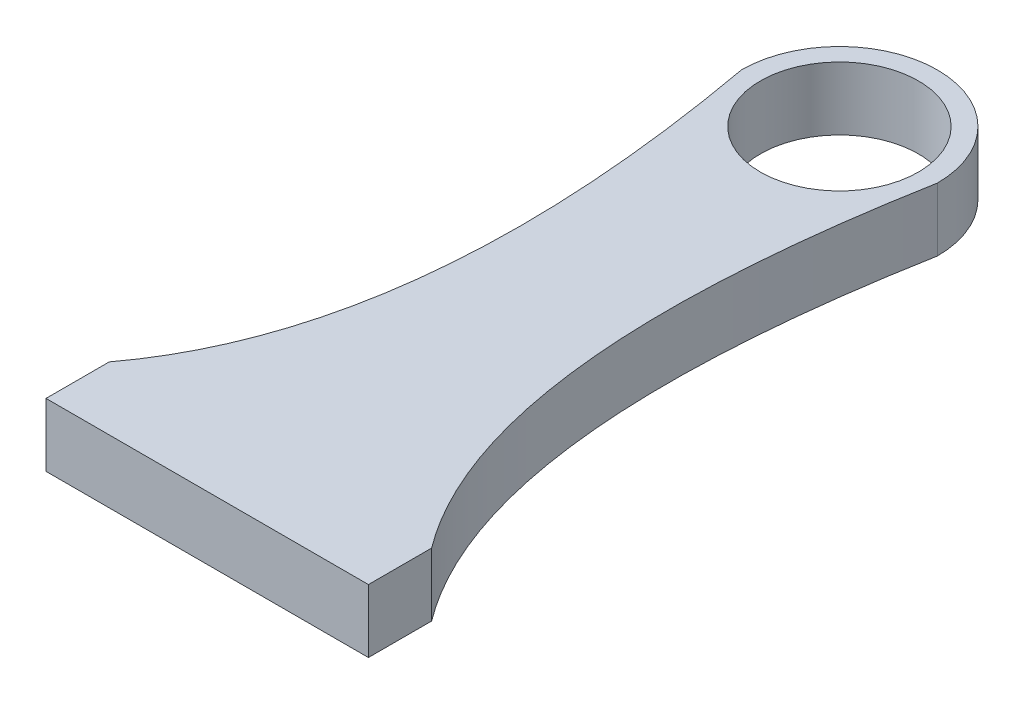
ISO-10303-21;
HEADER;
FILE_DESCRIPTION(('STEP AP214'),'2;1');
FILE_NAME('part.step','',(''),(''),'','','');
FILE_SCHEMA(('AUTOMOTIVE_DESIGN { 1 0 10303 214 1 1 1 1 }'));
ENDSEC;
DATA;
#1=APPLICATION_CONTEXT('core data for automotive mechanical design processes');
#2=APPLICATION_PROTOCOL_DEFINITION('international standard','automotive_design',2000,#1);
#3=PRODUCT_CONTEXT('',#1,'mechanical');
#4=PRODUCT('Part','Part','',(#3));
#5=PRODUCT_RELATED_PRODUCT_CATEGORY('part','',(#4));
#6=PRODUCT_DEFINITION_FORMATION('','',#4);
#7=PRODUCT_DEFINITION_CONTEXT('part definition',#1,'design');
#8=PRODUCT_DEFINITION('design','',#6,#7);
#9=PRODUCT_DEFINITION_SHAPE('','',#8);
#10=(LENGTH_UNIT() NAMED_UNIT(*) SI_UNIT(.MILLI.,.METRE.));
#11=(NAMED_UNIT(*) PLANE_ANGLE_UNIT() SI_UNIT($,.RADIAN.));
#12=(NAMED_UNIT(*) SI_UNIT($,.STERADIAN.) SOLID_ANGLE_UNIT());
#13=UNCERTAINTY_MEASURE_WITH_UNIT(LENGTH_MEASURE(1.E-05),#10,'distance_accuracy_value','');
#14=(GEOMETRIC_REPRESENTATION_CONTEXT(3) GLOBAL_UNCERTAINTY_ASSIGNED_CONTEXT((#13)) GLOBAL_UNIT_ASSIGNED_CONTEXT((#10,
#11,#12)) REPRESENTATION_CONTEXT('',''));
#15=CARTESIAN_POINT('',(0.,0.,0.));
#16=DIRECTION('',(0.,0.,1.));
#17=DIRECTION('',(1.,0.,0.));
#18=AXIS2_PLACEMENT_3D('',#15,#16,#17);
#19=CARTESIAN_POINT('',(0.,10.,0.));
#20=DIRECTION('',(0.,1.,0.));
#21=DIRECTION('',(0.,0.,1.));
#22=AXIS2_PLACEMENT_3D('',#19,#20,#21);
#23=PLANE('',#22);
#24=CARTESIAN_POINT('',(15.5,10.,0.));
#25=CARTESIAN_POINT('',(4.23681046825259,10.,61.6464472015278));
#26=CARTESIAN_POINT('',(25.5,10.,90.));
#27=B_SPLINE_CURVE_WITH_KNOTS('',2,(#24,#25,#26),.UNSPECIFIED.,.F.,.F.,(3,3),(0.,1.),.UNSPECIFIED.);
#28=CARTESIAN_POINT('',(15.5,10.,0.));
#29=VERTEX_POINT('',#28);
#30=CARTESIAN_POINT('',(25.5,10.,90.));
#31=VERTEX_POINT('',#30);
#32=EDGE_CURVE('E147',#29,#31,#27,.T.);
#33=ORIENTED_EDGE('',*,*,#32,.F.);
#34=CARTESIAN_POINT('',(0.,10.,0.));
#35=DIRECTION('',(0.,1.,0.));
#36=DIRECTION('',(0.,0.,1.));
#37=AXIS2_PLACEMENT_3D('',#34,#35,#36);
#38=CIRCLE('',#37,15.5);
#39=CARTESIAN_POINT('',(-15.5,10.,0.));
#40=VERTEX_POINT('',#39);
#41=EDGE_CURVE('E79',#29,#40,#38,.T.);
#42=ORIENTED_EDGE('',*,*,#41,.T.);
#43=CARTESIAN_POINT('',(-25.5,10.,90.));
#44=CARTESIAN_POINT('',(-4.23681046825257,10.,61.6464472015278));
#45=CARTESIAN_POINT('',(-15.5,10.,0.));
#46=B_SPLINE_CURVE_WITH_KNOTS('',2,(#43,#44,#45),.UNSPECIFIED.,.F.,.F.,(3,3),(0.,1.),.UNSPECIFIED.);
#47=CARTESIAN_POINT('',(-25.5,10.,90.));
#48=VERTEX_POINT('',#47);
#49=EDGE_CURVE('E49',#48,#40,#46,.T.);
#50=ORIENTED_EDGE('',*,*,#49,.F.);
#51=DIRECTION('',(0.,0.,1.));
#52=VECTOR('',#51,1.);
#53=CARTESIAN_POINT('',(-25.5,10.,90.));
#54=LINE('',#53,#52);
#55=CARTESIAN_POINT('',(-25.5,10.,100.));
#56=VERTEX_POINT('',#55);
#57=EDGE_CURVE('E77',#48,#56,#54,.T.);
#58=ORIENTED_EDGE('',*,*,#57,.T.);
#59=DIRECTION('',(1.,0.,0.));
#60=VECTOR('',#59,1.);
#61=CARTESIAN_POINT('',(-15.5,10.,100.));
#62=LINE('',#61,#60);
#63=CARTESIAN_POINT('',(25.5,10.,100.));
#64=VERTEX_POINT('',#63);
#65=EDGE_CURVE('E71',#56,#64,#62,.T.);
#66=ORIENTED_EDGE('',*,*,#65,.T.);
#67=DIRECTION('',(0.,0.,-1.));
#68=VECTOR('',#67,1.);
#69=CARTESIAN_POINT('',(25.5,10.,90.));
#70=LINE('',#69,#68);
#71=EDGE_CURVE('E75',#64,#31,#70,.T.);
#72=ORIENTED_EDGE('',*,*,#71,.T.);
#73=EDGE_LOOP('',(#33,#42,#50,#58,#66,#72));
#74=FACE_BOUND('',#73,.T.);
#75=CARTESIAN_POINT('',(0.,10.,0.));
#76=DIRECTION('',(0.,1.,0.));
#77=DIRECTION('',(0.,0.,1.));
#78=AXIS2_PLACEMENT_3D('',#75,#76,#77);
#79=CIRCLE('',#78,12.5);
#80=CARTESIAN_POINT('',(0.,10.,12.5));
#81=VERTEX_POINT('',#80);
#82=EDGE_CURVE('E107',#81,#81,#79,.T.);
#83=ORIENTED_EDGE('',*,*,#82,.F.);
#84=EDGE_LOOP('',(#83));
#85=FACE_BOUND('',#84,.T.);
#86=ADVANCED_FACE('F35',(#74,#85),#23,.T.);
#87=CARTESIAN_POINT('',(0.,0.,0.));
#88=DIRECTION('',(0.,1.,0.));
#89=DIRECTION('',(0.,0.,1.));
#90=AXIS2_PLACEMENT_3D('',#87,#88,#89);
#91=PLANE('',#90);
#92=CARTESIAN_POINT('',(0.,0.,0.));
#93=DIRECTION('',(0.,1.,0.));
#94=DIRECTION('',(0.,0.,1.));
#95=AXIS2_PLACEMENT_3D('',#92,#93,#94);
#96=CIRCLE('',#95,15.5);
#97=CARTESIAN_POINT('',(15.5,0.,0.));
#98=VERTEX_POINT('',#97);
#99=CARTESIAN_POINT('',(-15.5,0.,0.));
#100=VERTEX_POINT('',#99);
#101=EDGE_CURVE('E110',#98,#100,#96,.T.);
#102=ORIENTED_EDGE('',*,*,#101,.F.);
#103=CARTESIAN_POINT('',(15.5,0.,0.));
#104=CARTESIAN_POINT('',(4.23681046825259,0.,61.6464472015278));
#105=CARTESIAN_POINT('',(25.5,0.,90.));
#106=B_SPLINE_CURVE_WITH_KNOTS('',2,(#103,#104,#105),.UNSPECIFIED.,.F.,.F.,(3,3),(0.,1.),.UNSPECIFIED.);
#107=CARTESIAN_POINT('',(25.5,0.,90.));
#108=VERTEX_POINT('',#107);
#109=EDGE_CURVE('E135',#98,#108,#106,.T.);
#110=ORIENTED_EDGE('',*,*,#109,.T.);
#111=DIRECTION('',(0.,0.,-1.));
#112=VECTOR('',#111,1.);
#113=CARTESIAN_POINT('',(25.5,0.,90.));
#114=LINE('',#113,#112);
#115=CARTESIAN_POINT('',(25.5,0.,100.));
#116=VERTEX_POINT('',#115);
#117=EDGE_CURVE('E95',#116,#108,#114,.T.);
#118=ORIENTED_EDGE('',*,*,#117,.F.);
#119=DIRECTION('',(1.,0.,0.));
#120=VECTOR('',#119,1.);
#121=CARTESIAN_POINT('',(-15.5,0.,100.));
#122=LINE('',#121,#120);
#123=CARTESIAN_POINT('',(-25.5,0.,100.));
#124=VERTEX_POINT('',#123);
#125=EDGE_CURVE('E58',#124,#116,#122,.T.);
#126=ORIENTED_EDGE('',*,*,#125,.F.);
#127=DIRECTION('',(0.,0.,1.));
#128=VECTOR('',#127,1.);
#129=CARTESIAN_POINT('',(-25.5,0.,90.));
#130=LINE('',#129,#128);
#131=CARTESIAN_POINT('',(-25.5,0.,90.));
#132=VERTEX_POINT('',#131);
#133=EDGE_CURVE('E100',#132,#124,#130,.T.);
#134=ORIENTED_EDGE('',*,*,#133,.F.);
#135=CARTESIAN_POINT('',(-25.5,0.,90.));
#136=CARTESIAN_POINT('',(-4.23681046825257,0.,61.6464472015278));
#137=CARTESIAN_POINT('',(-15.5,0.,0.));
#138=B_SPLINE_CURVE_WITH_KNOTS('',2,(#135,#136,#137),.UNSPECIFIED.,.F.,.F.,(3,3),(0.,1.),.UNSPECIFIED.);
#139=EDGE_CURVE('E93',#132,#100,#138,.T.);
#140=ORIENTED_EDGE('',*,*,#139,.T.);
#141=EDGE_LOOP('',(#102,#110,#118,#126,#134,#140));
#142=FACE_BOUND('',#141,.T.);
#143=CARTESIAN_POINT('',(0.,0.,0.));
#144=DIRECTION('',(0.,1.,0.));
#145=DIRECTION('',(0.,0.,1.));
#146=AXIS2_PLACEMENT_3D('',#143,#144,#145);
#147=CIRCLE('',#146,12.5);
#148=CARTESIAN_POINT('',(0.,0.,12.5));
#149=VERTEX_POINT('',#148);
#150=EDGE_CURVE('E86',#149,#149,#147,.T.);
#151=ORIENTED_EDGE('',*,*,#150,.T.);
#152=EDGE_LOOP('',(#151));
#153=FACE_BOUND('',#152,.T.);
#154=ADVANCED_FACE('F133',(#142,#153),#91,.F.);
#155=CARTESIAN_POINT('',(0.,10.,0.));
#156=DIRECTION('',(0.,-1.,0.));
#157=DIRECTION('',(0.,0.,-1.));
#158=AXIS2_PLACEMENT_3D('',#155,#156,#157);
#159=CYLINDRICAL_SURFACE('',#158,15.5);
#160=ORIENTED_EDGE('',*,*,#101,.T.);
#161=DIRECTION('',(0.,-1.,0.));
#162=VECTOR('',#161,1.);
#163=CARTESIAN_POINT('',(-15.5,10.,0.));
#164=LINE('',#163,#162);
#165=EDGE_CURVE('E11',#40,#100,#164,.T.);
#166=ORIENTED_EDGE('',*,*,#165,.F.);
#167=ORIENTED_EDGE('',*,*,#41,.F.);
#168=DIRECTION('',(0.,-1.,0.));
#169=VECTOR('',#168,1.);
#170=CARTESIAN_POINT('',(15.5,10.,0.));
#171=LINE('',#170,#169);
#172=EDGE_CURVE('E43',#29,#98,#171,.T.);
#173=ORIENTED_EDGE('',*,*,#172,.T.);
#174=EDGE_LOOP('',(#160,#166,#167,#173));
#175=FACE_BOUND('',#174,.T.);
#176=ADVANCED_FACE('F37',(#175),#159,.T.);
#177=CARTESIAN_POINT('',(-15.5,10.,100.));
#178=DIRECTION('',(0.,0.,-1.));
#179=DIRECTION('',(-1.,0.,0.));
#180=AXIS2_PLACEMENT_3D('',#177,#178,#179);
#181=PLANE('',#180);
#182=ORIENTED_EDGE('',*,*,#125,.T.);
#183=DIRECTION('',(0.,1.,0.));
#184=VECTOR('',#183,1.);
#185=CARTESIAN_POINT('',(25.5,0.,100.));
#186=LINE('',#185,#184);
#187=EDGE_CURVE('E81',#116,#64,#186,.T.);
#188=ORIENTED_EDGE('',*,*,#187,.T.);
#189=ORIENTED_EDGE('',*,*,#65,.F.);
#190=DIRECTION('',(0.,1.,0.));
#191=VECTOR('',#190,1.);
#192=CARTESIAN_POINT('',(-25.5,0.,100.));
#193=LINE('',#192,#191);
#194=EDGE_CURVE('E87',#124,#56,#193,.T.);
#195=ORIENTED_EDGE('',*,*,#194,.F.);
#196=EDGE_LOOP('',(#182,#188,#189,#195));
#197=FACE_BOUND('',#196,.T.);
#198=ADVANCED_FACE('F82',(#197),#181,.F.);
#199=CARTESIAN_POINT('',(0.,10.,0.));
#200=DIRECTION('',(0.,-1.,0.));
#201=DIRECTION('',(0.,0.,-1.));
#202=AXIS2_PLACEMENT_3D('',#199,#200,#201);
#203=CYLINDRICAL_SURFACE('',#202,12.5);
#204=ORIENTED_EDGE('',*,*,#82,.T.);
#205=EDGE_LOOP('',(#204));
#206=FACE_BOUND('',#205,.T.);
#207=ORIENTED_EDGE('',*,*,#150,.F.);
#208=EDGE_LOOP('',(#207));
#209=FACE_BOUND('',#208,.T.);
#210=ADVANCED_FACE('F176',(#206,#209),#203,.F.);
#211=CARTESIAN_POINT('',(25.5,0.,90.));
#212=DIRECTION('',(1.,0.,0.));
#213=DIRECTION('',(0.,0.,-1.));
#214=AXIS2_PLACEMENT_3D('',#211,#212,#213);
#215=PLANE('',#214);
#216=ORIENTED_EDGE('',*,*,#71,.F.);
#217=ORIENTED_EDGE('',*,*,#187,.F.);
#218=ORIENTED_EDGE('',*,*,#117,.T.);
#219=DIRECTION('',(0.,1.,0.));
#220=VECTOR('',#219,1.);
#221=CARTESIAN_POINT('',(25.5,0.,90.));
#222=LINE('',#221,#220);
#223=EDGE_CURVE('E92',#108,#31,#222,.T.);
#224=ORIENTED_EDGE('',*,*,#223,.T.);
#225=EDGE_LOOP('',(#216,#217,#218,#224));
#226=FACE_BOUND('',#225,.T.);
#227=ADVANCED_FACE('F90',(#226),#215,.T.);
#228=CARTESIAN_POINT('',(-25.5,0.,90.));
#229=DIRECTION('',(-1.,0.,0.));
#230=DIRECTION('',(0.,0.,1.));
#231=AXIS2_PLACEMENT_3D('',#228,#229,#230);
#232=PLANE('',#231);
#233=ORIENTED_EDGE('',*,*,#57,.F.);
#234=DIRECTION('',(0.,1.,0.));
#235=VECTOR('',#234,1.);
#236=CARTESIAN_POINT('',(-25.5,0.,90.));
#237=LINE('',#236,#235);
#238=EDGE_CURVE('E104',#132,#48,#237,.T.);
#239=ORIENTED_EDGE('',*,*,#238,.F.);
#240=ORIENTED_EDGE('',*,*,#133,.T.);
#241=ORIENTED_EDGE('',*,*,#194,.T.);
#242=EDGE_LOOP('',(#233,#239,#240,#241));
#243=FACE_BOUND('',#242,.T.);
#244=ADVANCED_FACE('F145',(#243),#232,.T.);
#245=DIRECTION('',(0.,1.,0.));
#246=VECTOR('',#245,1.);
#247=SURFACE_OF_LINEAR_EXTRUSION('',#138,#246);
#248=ORIENTED_EDGE('',*,*,#49,.T.);
#249=ORIENTED_EDGE('',*,*,#165,.T.);
#250=ORIENTED_EDGE('',*,*,#139,.F.);
#251=ORIENTED_EDGE('',*,*,#238,.T.);
#252=EDGE_LOOP('',(#248,#249,#250,#251));
#253=FACE_BOUND('',#252,.T.);
#254=ADVANCED_FACE('F142',(#253),#247,.F.);
#255=DIRECTION('',(0.,1.,0.));
#256=VECTOR('',#255,1.);
#257=SURFACE_OF_LINEAR_EXTRUSION('',#106,#256);
#258=ORIENTED_EDGE('',*,*,#32,.T.);
#259=ORIENTED_EDGE('',*,*,#223,.F.);
#260=ORIENTED_EDGE('',*,*,#109,.F.);
#261=ORIENTED_EDGE('',*,*,#172,.F.);
#262=EDGE_LOOP('',(#258,#259,#260,#261));
#263=FACE_BOUND('',#262,.T.);
#264=ADVANCED_FACE('F148',(#263),#257,.F.);
#265=CLOSED_SHELL('',(#86,#154,#176,#198,#210,#227,#244,#254,#264));
#266=MANIFOLD_SOLID_BREP('B2',#265);
#267=ADVANCED_BREP_SHAPE_REPRESENTATION('',(#18,#266),#14);
#268=SHAPE_DEFINITION_REPRESENTATION(#9,#267);
ENDSEC;
END-ISO-10303-21;
